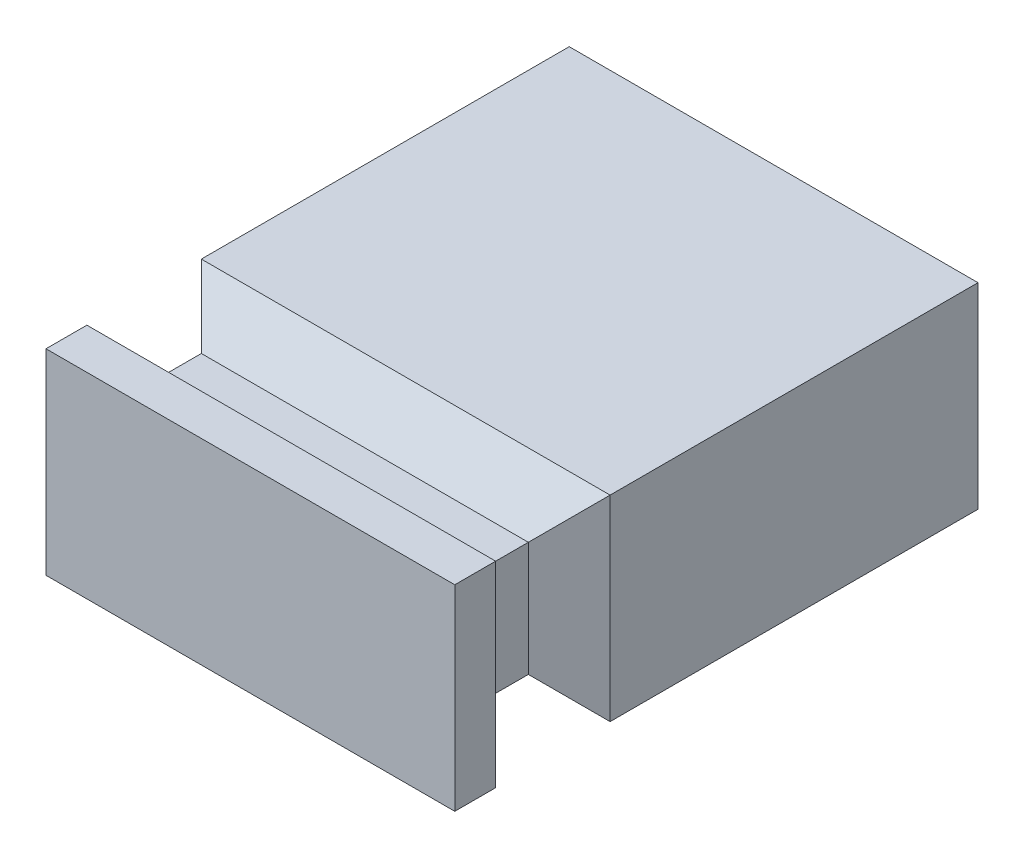
ISO-10303-21;
HEADER;
FILE_DESCRIPTION(('STEP AP214'),'2;1');
FILE_NAME('part.step','',(''),(''),'','','');
FILE_SCHEMA(('AUTOMOTIVE_DESIGN { 1 0 10303 214 1 1 1 1 }'));
ENDSEC;
DATA;
#1=APPLICATION_CONTEXT('core data for automotive mechanical design processes');
#2=APPLICATION_PROTOCOL_DEFINITION('international standard','automotive_design',2000,#1);
#3=PRODUCT_CONTEXT('',#1,'mechanical');
#4=PRODUCT('Part','Part','',(#3));
#5=PRODUCT_RELATED_PRODUCT_CATEGORY('part','',(#4));
#6=PRODUCT_DEFINITION_FORMATION('','',#4);
#7=PRODUCT_DEFINITION_CONTEXT('part definition',#1,'design');
#8=PRODUCT_DEFINITION('design','',#6,#7);
#9=PRODUCT_DEFINITION_SHAPE('','',#8);
#10=(LENGTH_UNIT() NAMED_UNIT(*) SI_UNIT(.MILLI.,.METRE.));
#11=(NAMED_UNIT(*) PLANE_ANGLE_UNIT() SI_UNIT($,.RADIAN.));
#12=(NAMED_UNIT(*) SI_UNIT($,.STERADIAN.) SOLID_ANGLE_UNIT());
#13=UNCERTAINTY_MEASURE_WITH_UNIT(LENGTH_MEASURE(1.E-05),#10,'distance_accuracy_value','');
#14=(GEOMETRIC_REPRESENTATION_CONTEXT(3) GLOBAL_UNCERTAINTY_ASSIGNED_CONTEXT((#13)) GLOBAL_UNIT_ASSIGNED_CONTEXT((#10,
#11,#12)) REPRESENTATION_CONTEXT('',''));
#15=CARTESIAN_POINT('',(0.,0.,0.));
#16=DIRECTION('',(0.,0.,1.));
#17=DIRECTION('',(1.,0.,0.));
#18=AXIS2_PLACEMENT_3D('',#15,#16,#17);
#19=CARTESIAN_POINT('',(-2.5,-1.2,5.9));
#20=DIRECTION('',(-0.707106781186548,0.,-0.707106781186548));
#21=DIRECTION('',(-0.707106781186548,0.,0.707106781186548));
#22=AXIS2_PLACEMENT_3D('',#19,#20,#21);
#23=PLANE('',#22);
#24=DIRECTION('',(-0.577350269189626,-0.577350269189626,0.577350269189626));
#25=VECTOR('',#24,1.);
#26=CARTESIAN_POINT('',(-2.,-0.7,5.4));
#27=LINE('',#26,#25);
#28=CARTESIAN_POINT('',(-2.,-0.7,5.4));
#29=VERTEX_POINT('',#28);
#30=CARTESIAN_POINT('',(-2.5,-1.2,5.9));
#31=VERTEX_POINT('',#30);
#32=EDGE_CURVE('E184',#29,#31,#27,.T.);
#33=ORIENTED_EDGE('',*,*,#32,.T.);
#34=DIRECTION('',(0.,1.,0.));
#35=VECTOR('',#34,1.);
#36=CARTESIAN_POINT('',(-2.5,-1.2,5.9));
#37=LINE('',#36,#35);
#38=CARTESIAN_POINT('',(-2.5,1.2,5.9));
#39=VERTEX_POINT('',#38);
#40=EDGE_CURVE('E155',#31,#39,#37,.T.);
#41=ORIENTED_EDGE('',*,*,#40,.T.);
#42=DIRECTION('',(0.577350269189626,-0.577350269189626,-0.577350269189626));
#43=VECTOR('',#42,1.);
#44=CARTESIAN_POINT('',(-2.5,1.2,5.9));
#45=LINE('',#44,#43);
#46=CARTESIAN_POINT('',(-2.,0.700000000000001,5.4));
#47=VERTEX_POINT('',#46);
#48=EDGE_CURVE('E19',#39,#47,#45,.T.);
#49=ORIENTED_EDGE('',*,*,#48,.T.);
#50=DIRECTION('',(0.,1.,0.));
#51=VECTOR('',#50,1.);
#52=CARTESIAN_POINT('',(-2.,-1.2,5.4));
#53=LINE('',#52,#51);
#54=EDGE_CURVE('E150',#47,#29,#53,.F.);
#55=ORIENTED_EDGE('',*,*,#54,.T.);
#56=EDGE_LOOP('',(#33,#41,#49,#55));
#57=FACE_BOUND('',#56,.T.);
#58=ADVANCED_FACE('F16',(#57),#23,.T.);
#59=CARTESIAN_POINT('',(2.5,1.2,5.9));
#60=DIRECTION('',(0.707106781186548,0.,-0.707106781186548));
#61=DIRECTION('',(-0.707106781186548,0.,-0.707106781186548));
#62=AXIS2_PLACEMENT_3D('',#59,#60,#61);
#63=PLANE('',#62);
#64=DIRECTION('',(-0.577350269189626,0.577350269189626,-0.577350269189626));
#65=VECTOR('',#64,1.);
#66=CARTESIAN_POINT('',(2.5,-1.2,5.9));
#67=LINE('',#66,#65);
#68=CARTESIAN_POINT('',(2.5,-1.2,5.9));
#69=VERTEX_POINT('',#68);
#70=CARTESIAN_POINT('',(2.,-0.700000000000001,5.4));
#71=VERTEX_POINT('',#70);
#72=EDGE_CURVE('E188',#69,#71,#67,.T.);
#73=ORIENTED_EDGE('',*,*,#72,.T.);
#74=DIRECTION('',(0.,1.,0.));
#75=VECTOR('',#74,1.);
#76=CARTESIAN_POINT('',(2.,1.2,5.4));
#77=LINE('',#76,#75);
#78=CARTESIAN_POINT('',(2.,0.7,5.4));
#79=VERTEX_POINT('',#78);
#80=EDGE_CURVE('E190',#71,#79,#77,.T.);
#81=ORIENTED_EDGE('',*,*,#80,.T.);
#82=DIRECTION('',(0.577350269189626,0.577350269189626,0.577350269189626));
#83=VECTOR('',#82,1.);
#84=CARTESIAN_POINT('',(2.,0.7,5.4));
#85=LINE('',#84,#83);
#86=CARTESIAN_POINT('',(2.5,1.2,5.9));
#87=VERTEX_POINT('',#86);
#88=EDGE_CURVE('E177',#79,#87,#85,.T.);
#89=ORIENTED_EDGE('',*,*,#88,.T.);
#90=DIRECTION('',(0.,1.,0.));
#91=VECTOR('',#90,1.);
#92=CARTESIAN_POINT('',(2.5,1.2,5.9));
#93=LINE('',#92,#91);
#94=EDGE_CURVE('E196',#87,#69,#93,.F.);
#95=ORIENTED_EDGE('',*,*,#94,.T.);
#96=EDGE_LOOP('',(#73,#81,#89,#95));
#97=FACE_BOUND('',#96,.T.);
#98=ADVANCED_FACE('F462',(#97),#63,.T.);
#99=CARTESIAN_POINT('',(-2.5,-1.2,6.4));
#100=DIRECTION('',(1.,0.,0.));
#101=DIRECTION('',(0.,0.,-1.));
#102=AXIS2_PLACEMENT_3D('',#99,#100,#101);
#103=PLANE('',#102);
#104=ORIENTED_EDGE('',*,*,#40,.F.);
#105=DIRECTION('',(0.,0.,-1.));
#106=VECTOR('',#105,1.);
#107=CARTESIAN_POINT('',(-2.5,-1.2,6.4));
#108=LINE('',#107,#106);
#109=CARTESIAN_POINT('',(-2.5,-1.2,6.4));
#110=VERTEX_POINT('',#109);
#111=EDGE_CURVE('E192',#110,#31,#108,.T.);
#112=ORIENTED_EDGE('',*,*,#111,.F.);
#113=DIRECTION('',(0.,1.,0.));
#114=VECTOR('',#113,1.);
#115=CARTESIAN_POINT('',(-2.5,-1.2,6.4));
#116=LINE('',#115,#114);
#117=CARTESIAN_POINT('',(-2.5,1.2,6.4));
#118=VERTEX_POINT('',#117);
#119=EDGE_CURVE('E205',#110,#118,#116,.T.);
#120=ORIENTED_EDGE('',*,*,#119,.T.);
#121=DIRECTION('',(0.,0.,-1.));
#122=VECTOR('',#121,1.);
#123=CARTESIAN_POINT('',(-2.5,1.2,6.4));
#124=LINE('',#123,#122);
#125=EDGE_CURVE('E201',#118,#39,#124,.T.);
#126=ORIENTED_EDGE('',*,*,#125,.T.);
#127=EDGE_LOOP('',(#104,#112,#120,#126));
#128=FACE_BOUND('',#127,.T.);
#129=ADVANCED_FACE('F459',(#128),#103,.F.);
#130=CARTESIAN_POINT('',(2.5,1.2,6.4));
#131=DIRECTION('',(-1.,0.,0.));
#132=DIRECTION('',(0.,0.,1.));
#133=AXIS2_PLACEMENT_3D('',#130,#131,#132);
#134=PLANE('',#133);
#135=ORIENTED_EDGE('',*,*,#94,.F.);
#136=DIRECTION('',(0.,0.,-1.));
#137=VECTOR('',#136,1.);
#138=CARTESIAN_POINT('',(2.5,1.2,6.4));
#139=LINE('',#138,#137);
#140=CARTESIAN_POINT('',(2.5,1.2,6.4));
#141=VERTEX_POINT('',#140);
#142=EDGE_CURVE('E203',#87,#141,#139,.F.);
#143=ORIENTED_EDGE('',*,*,#142,.T.);
#144=DIRECTION('',(0.,1.,0.));
#145=VECTOR('',#144,1.);
#146=CARTESIAN_POINT('',(2.5,-1.2,6.4));
#147=LINE('',#146,#145);
#148=CARTESIAN_POINT('',(2.5,-1.2,6.4));
#149=VERTEX_POINT('',#148);
#150=EDGE_CURVE('E211',#141,#149,#147,.F.);
#151=ORIENTED_EDGE('',*,*,#150,.T.);
#152=DIRECTION('',(0.,0.,1.));
#153=VECTOR('',#152,1.);
#154=CARTESIAN_POINT('',(2.5,-1.2,6.4));
#155=LINE('',#154,#153);
#156=EDGE_CURVE('E199',#69,#149,#155,.T.);
#157=ORIENTED_EDGE('',*,*,#156,.F.);
#158=EDGE_LOOP('',(#135,#143,#151,#157));
#159=FACE_BOUND('',#158,.T.);
#160=ADVANCED_FACE('F455',(#159),#134,.F.);
#161=CARTESIAN_POINT('',(-2.5,1.2,6.4));
#162=DIRECTION('',(0.,-1.,0.));
#163=DIRECTION('',(0.,0.,-1.));
#164=AXIS2_PLACEMENT_3D('',#161,#162,#163);
#165=PLANE('',#164);
#166=DIRECTION('',(1.,0.,0.));
#167=VECTOR('',#166,1.);
#168=CARTESIAN_POINT('',(-2.5,1.2,5.9));
#169=LINE('',#168,#167);
#170=EDGE_CURVE('E214',#39,#87,#169,.T.);
#171=ORIENTED_EDGE('',*,*,#170,.F.);
#172=ORIENTED_EDGE('',*,*,#125,.F.);
#173=DIRECTION('',(-1.,0.,0.));
#174=VECTOR('',#173,1.);
#175=CARTESIAN_POINT('',(-2.5,1.2,6.4));
#176=LINE('',#175,#174);
#177=EDGE_CURVE('E208',#118,#141,#176,.F.);
#178=ORIENTED_EDGE('',*,*,#177,.T.);
#179=ORIENTED_EDGE('',*,*,#142,.F.);
#180=EDGE_LOOP('',(#171,#172,#178,#179));
#181=FACE_BOUND('',#180,.T.);
#182=ADVANCED_FACE('F451',(#181),#165,.F.);
#183=CARTESIAN_POINT('',(-2.5,-1.2,6.4));
#184=DIRECTION('',(0.,0.,-1.));
#185=DIRECTION('',(-1.,0.,0.));
#186=AXIS2_PLACEMENT_3D('',#183,#184,#185);
#187=PLANE('',#186);
#188=ORIENTED_EDGE('',*,*,#150,.F.);
#189=ORIENTED_EDGE('',*,*,#177,.F.);
#190=ORIENTED_EDGE('',*,*,#119,.F.);
#191=DIRECTION('',(1.,0.,0.));
#192=VECTOR('',#191,1.);
#193=CARTESIAN_POINT('',(2.5,-1.2,6.4));
#194=LINE('',#193,#192);
#195=EDGE_CURVE('E179',#110,#149,#194,.T.);
#196=ORIENTED_EDGE('',*,*,#195,.T.);
#197=EDGE_LOOP('',(#188,#189,#190,#196));
#198=FACE_BOUND('',#197,.T.);
#199=ADVANCED_FACE('F448',(#198),#187,.F.);
#200=CARTESIAN_POINT('',(-2.5,1.2,5.9));
#201=DIRECTION('',(0.,0.707106781186548,-0.707106781186548));
#202=DIRECTION('',(0.,0.707106781186548,0.707106781186548));
#203=AXIS2_PLACEMENT_3D('',#200,#201,#202);
#204=PLANE('',#203);
#205=ORIENTED_EDGE('',*,*,#48,.F.);
#206=ORIENTED_EDGE('',*,*,#170,.T.);
#207=ORIENTED_EDGE('',*,*,#88,.F.);
#208=DIRECTION('',(1.,0.,0.));
#209=VECTOR('',#208,1.);
#210=CARTESIAN_POINT('',(2.,0.7,5.4));
#211=LINE('',#210,#209);
#212=EDGE_CURVE('E166',#79,#47,#211,.F.);
#213=ORIENTED_EDGE('',*,*,#212,.T.);
#214=EDGE_LOOP('',(#205,#206,#207,#213));
#215=FACE_BOUND('',#214,.T.);
#216=ADVANCED_FACE('F176',(#215),#204,.T.);
#217=CARTESIAN_POINT('',(-1.5875,0.3175,5.898025612107));
#218=DIRECTION('',(0.,-1.,0.));
#219=DIRECTION('',(1.,0.,0.));
#220=AXIS2_PLACEMENT_3D('',#217,#218,#219);
#221=PLANE('',#220);
#222=DIRECTION('',(0.,0.,1.));
#223=VECTOR('',#222,1.);
#224=CARTESIAN_POINT('',(-0.9525,0.3175,5.898025612107));
#225=LINE('',#224,#223);
#226=CARTESIAN_POINT('',(-0.9525,0.3175,5.));
#227=VERTEX_POINT('',#226);
#228=CARTESIAN_POINT('',(-0.9525,0.3175,0.));
#229=VERTEX_POINT('',#228);
#230=EDGE_CURVE('E178',#227,#229,#225,.F.);
#231=ORIENTED_EDGE('',*,*,#230,.F.);
#232=DIRECTION('',(1.,0.,0.));
#233=VECTOR('',#232,1.);
#234=CARTESIAN_POINT('',(-1.5875,0.3175,5.));
#235=LINE('',#234,#233);
#236=CARTESIAN_POINT('',(-1.5875,0.3175,5.));
#237=VERTEX_POINT('',#236);
#238=EDGE_CURVE('E218',#227,#237,#235,.F.);
#239=ORIENTED_EDGE('',*,*,#238,.T.);
#240=DIRECTION('',(0.,0.,-1.));
#241=VECTOR('',#240,1.);
#242=CARTESIAN_POINT('',(-1.5875,0.3175,5.898025612107));
#243=LINE('',#242,#241);
#244=CARTESIAN_POINT('',(-1.5875,0.3175,0.));
#245=VERTEX_POINT('',#244);
#246=EDGE_CURVE('E232',#245,#237,#243,.F.);
#247=ORIENTED_EDGE('',*,*,#246,.F.);
#248=DIRECTION('',(1.,0.,0.));
#249=VECTOR('',#248,1.);
#250=CARTESIAN_POINT('',(-1.5875,0.3175,0.));
#251=LINE('',#250,#249);
#252=EDGE_CURVE('E216',#245,#229,#251,.T.);
#253=ORIENTED_EDGE('',*,*,#252,.T.);
#254=EDGE_LOOP('',(#231,#239,#247,#253));
#255=FACE_BOUND('',#254,.T.);
#256=ADVANCED_FACE('F441',(#255),#221,.T.);
#257=CARTESIAN_POINT('',(0.9525,0.3175,5.898025612107));
#258=DIRECTION('',(0.,-1.,0.));
#259=DIRECTION('',(1.,0.,0.));
#260=AXIS2_PLACEMENT_3D('',#257,#258,#259);
#261=PLANE('',#260);
#262=DIRECTION('',(0.,0.,1.));
#263=VECTOR('',#262,1.);
#264=CARTESIAN_POINT('',(1.5875,0.3175,5.898025612107));
#265=LINE('',#264,#263);
#266=CARTESIAN_POINT('',(1.5875,0.3175,5.));
#267=VERTEX_POINT('',#266);
#268=CARTESIAN_POINT('',(1.5875,0.3175,0.));
#269=VERTEX_POINT('',#268);
#270=EDGE_CURVE('E241',#267,#269,#265,.F.);
#271=ORIENTED_EDGE('',*,*,#270,.F.);
#272=DIRECTION('',(1.,0.,0.));
#273=VECTOR('',#272,1.);
#274=CARTESIAN_POINT('',(0.9525,0.3175,5.));
#275=LINE('',#274,#273);
#276=CARTESIAN_POINT('',(0.9525,0.3175,5.));
#277=VERTEX_POINT('',#276);
#278=EDGE_CURVE('E222',#267,#277,#275,.F.);
#279=ORIENTED_EDGE('',*,*,#278,.T.);
#280=DIRECTION('',(0.,0.,-1.));
#281=VECTOR('',#280,1.);
#282=CARTESIAN_POINT('',(0.9525,0.3175,5.898025612107));
#283=LINE('',#282,#281);
#284=CARTESIAN_POINT('',(0.9525,0.3175,0.));
#285=VERTEX_POINT('',#284);
#286=EDGE_CURVE('E248',#285,#277,#283,.F.);
#287=ORIENTED_EDGE('',*,*,#286,.F.);
#288=DIRECTION('',(1.,0.,0.));
#289=VECTOR('',#288,1.);
#290=CARTESIAN_POINT('',(0.9525,0.3175,0.));
#291=LINE('',#290,#289);
#292=EDGE_CURVE('E220',#285,#269,#291,.T.);
#293=ORIENTED_EDGE('',*,*,#292,.T.);
#294=EDGE_LOOP('',(#271,#279,#287,#293));
#295=FACE_BOUND('',#294,.T.);
#296=ADVANCED_FACE('F437',(#295),#261,.T.);
#297=CARTESIAN_POINT('',(2.5,-1.2,6.4));
#298=DIRECTION('',(0.,1.,0.));
#299=DIRECTION('',(0.,0.,1.));
#300=AXIS2_PLACEMENT_3D('',#297,#298,#299);
#301=PLANE('',#300);
#302=DIRECTION('',(1.,0.,0.));
#303=VECTOR('',#302,1.);
#304=CARTESIAN_POINT('',(2.5,-1.2,5.9));
#305=LINE('',#304,#303);
#306=EDGE_CURVE('E257',#69,#31,#305,.F.);
#307=ORIENTED_EDGE('',*,*,#306,.F.);
#308=ORIENTED_EDGE('',*,*,#156,.T.);
#309=ORIENTED_EDGE('',*,*,#195,.F.);
#310=ORIENTED_EDGE('',*,*,#111,.T.);
#311=EDGE_LOOP('',(#307,#308,#309,#310));
#312=FACE_BOUND('',#311,.T.);
#313=ADVANCED_FACE('F434',(#312),#301,.F.);
#314=CARTESIAN_POINT('',(2.,0.7,5.4));
#315=DIRECTION('',(0.,-1.,0.));
#316=DIRECTION('',(0.,0.,-1.));
#317=AXIS2_PLACEMENT_3D('',#314,#315,#316);
#318=PLANE('',#317);
#319=DIRECTION('',(0.,0.,-1.));
#320=VECTOR('',#319,1.);
#321=CARTESIAN_POINT('',(-2.,0.7,5.4));
#322=LINE('',#321,#320);
#323=CARTESIAN_POINT('',(-2.,0.7,5.));
#324=VERTEX_POINT('',#323);
#325=EDGE_CURVE('E163',#324,#47,#322,.F.);
#326=ORIENTED_EDGE('',*,*,#325,.T.);
#327=ORIENTED_EDGE('',*,*,#212,.F.);
#328=DIRECTION('',(0.,0.,1.));
#329=VECTOR('',#328,1.);
#330=CARTESIAN_POINT('',(2.,0.7,5.4));
#331=LINE('',#330,#329);
#332=CARTESIAN_POINT('',(2.,0.7,5.));
#333=VERTEX_POINT('',#332);
#334=EDGE_CURVE('E260',#79,#333,#331,.F.);
#335=ORIENTED_EDGE('',*,*,#334,.T.);
#336=DIRECTION('',(1.,0.,0.));
#337=VECTOR('',#336,1.);
#338=CARTESIAN_POINT('',(-2.5,0.7,5.));
#339=LINE('',#338,#337);
#340=EDGE_CURVE('E168',#333,#324,#339,.F.);
#341=ORIENTED_EDGE('',*,*,#340,.T.);
#342=EDGE_LOOP('',(#326,#327,#335,#341));
#343=FACE_BOUND('',#342,.T.);
#344=ADVANCED_FACE('F164',(#343),#318,.F.);
#345=CARTESIAN_POINT('',(-0.9525,-0.3175,5.898025612107));
#346=DIRECTION('',(-1.,0.,0.));
#347=DIRECTION('',(0.,0.,1.));
#348=AXIS2_PLACEMENT_3D('',#345,#346,#347);
#349=PLANE('',#348);
#350=DIRECTION('',(0.,0.,1.));
#351=VECTOR('',#350,1.);
#352=CARTESIAN_POINT('',(-0.9525,-0.3175,5.898025612107));
#353=LINE('',#352,#351);
#354=CARTESIAN_POINT('',(-0.9525,-0.3175,5.));
#355=VERTEX_POINT('',#354);
#356=CARTESIAN_POINT('',(-0.9525,-0.3175,0.));
#357=VERTEX_POINT('',#356);
#358=EDGE_CURVE('E263',#355,#357,#353,.F.);
#359=ORIENTED_EDGE('',*,*,#358,.F.);
#360=DIRECTION('',(0.,1.,0.));
#361=VECTOR('',#360,1.);
#362=CARTESIAN_POINT('',(-0.9525,-0.7,5.));
#363=LINE('',#362,#361);
#364=EDGE_CURVE('E238',#355,#227,#363,.T.);
#365=ORIENTED_EDGE('',*,*,#364,.T.);
#366=ORIENTED_EDGE('',*,*,#230,.T.);
#367=DIRECTION('',(0.,1.,0.));
#368=VECTOR('',#367,1.);
#369=CARTESIAN_POINT('',(-0.9525,-0.3175,0.));
#370=LINE('',#369,#368);
#371=EDGE_CURVE('E228',#229,#357,#370,.F.);
#372=ORIENTED_EDGE('',*,*,#371,.T.);
#373=EDGE_LOOP('',(#359,#365,#366,#372));
#374=FACE_BOUND('',#373,.T.);
#375=ADVANCED_FACE('F427',(#374),#349,.T.);
#376=CARTESIAN_POINT('',(-1.5875,-0.3175,5.898025612107));
#377=DIRECTION('',(1.,0.,0.));
#378=DIRECTION('',(0.,0.,-1.));
#379=AXIS2_PLACEMENT_3D('',#376,#377,#378);
#380=PLANE('',#379);
#381=ORIENTED_EDGE('',*,*,#246,.T.);
#382=DIRECTION('',(0.,1.,0.));
#383=VECTOR('',#382,1.);
#384=CARTESIAN_POINT('',(-1.5875,-0.7,5.));
#385=LINE('',#384,#383);
#386=CARTESIAN_POINT('',(-1.5875,-0.3175,5.));
#387=VERTEX_POINT('',#386);
#388=EDGE_CURVE('E235',#237,#387,#385,.F.);
#389=ORIENTED_EDGE('',*,*,#388,.T.);
#390=DIRECTION('',(0.,0.,1.));
#391=VECTOR('',#390,1.);
#392=CARTESIAN_POINT('',(-1.5875,-0.3175,5.898025612107));
#393=LINE('',#392,#391);
#394=CARTESIAN_POINT('',(-1.5875,-0.3175,0.));
#395=VERTEX_POINT('',#394);
#396=EDGE_CURVE('E266',#395,#387,#393,.T.);
#397=ORIENTED_EDGE('',*,*,#396,.F.);
#398=DIRECTION('',(0.,1.,0.));
#399=VECTOR('',#398,1.);
#400=CARTESIAN_POINT('',(-1.5875,-0.3175,0.));
#401=LINE('',#400,#399);
#402=EDGE_CURVE('E230',#395,#245,#401,.T.);
#403=ORIENTED_EDGE('',*,*,#402,.T.);
#404=EDGE_LOOP('',(#381,#389,#397,#403));
#405=FACE_BOUND('',#404,.T.);
#406=ADVANCED_FACE('F423',(#405),#380,.T.);
#407=CARTESIAN_POINT('',(-2.,-0.7,5.));
#408=DIRECTION('',(0.,0.,1.));
#409=DIRECTION('',(1.,0.,0.));
#410=AXIS2_PLACEMENT_3D('',#407,#408,#409);
#411=PLANE('',#410);
#412=ORIENTED_EDGE('',*,*,#364,.F.);
#413=DIRECTION('',(-1.,0.,0.));
#414=VECTOR('',#413,1.);
#415=CARTESIAN_POINT('',(-1.5875,-0.3175,5.));
#416=LINE('',#415,#414);
#417=EDGE_CURVE('E268',#387,#355,#416,.F.);
#418=ORIENTED_EDGE('',*,*,#417,.F.);
#419=ORIENTED_EDGE('',*,*,#388,.F.);
#420=ORIENTED_EDGE('',*,*,#238,.F.);
#421=EDGE_LOOP('',(#412,#418,#419,#420));
#422=FACE_BOUND('',#421,.T.);
#423=ADVANCED_FACE('F419',(#422),#411,.F.);
#424=CARTESIAN_POINT('',(1.5875,-0.3175,5.898025612107));
#425=DIRECTION('',(-1.,0.,0.));
#426=DIRECTION('',(0.,0.,1.));
#427=AXIS2_PLACEMENT_3D('',#424,#425,#426);
#428=PLANE('',#427);
#429=DIRECTION('',(0.,0.,1.));
#430=VECTOR('',#429,1.);
#431=CARTESIAN_POINT('',(1.5875,-0.3175,5.898025612107));
#432=LINE('',#431,#430);
#433=CARTESIAN_POINT('',(1.5875,-0.3175,5.));
#434=VERTEX_POINT('',#433);
#435=CARTESIAN_POINT('',(1.5875,-0.3175,0.));
#436=VERTEX_POINT('',#435);
#437=EDGE_CURVE('E271',#434,#436,#432,.F.);
#438=ORIENTED_EDGE('',*,*,#437,.F.);
#439=DIRECTION('',(0.,1.,0.));
#440=VECTOR('',#439,1.);
#441=CARTESIAN_POINT('',(1.5875,-0.7,5.));
#442=LINE('',#441,#440);
#443=EDGE_CURVE('E174',#434,#267,#442,.T.);
#444=ORIENTED_EDGE('',*,*,#443,.T.);
#445=ORIENTED_EDGE('',*,*,#270,.T.);
#446=DIRECTION('',(0.,1.,0.));
#447=VECTOR('',#446,1.);
#448=CARTESIAN_POINT('',(1.5875,-0.3175,0.));
#449=LINE('',#448,#447);
#450=EDGE_CURVE('E244',#269,#436,#449,.F.);
#451=ORIENTED_EDGE('',*,*,#450,.T.);
#452=EDGE_LOOP('',(#438,#444,#445,#451));
#453=FACE_BOUND('',#452,.T.);
#454=ADVANCED_FACE('F415',(#453),#428,.T.);
#455=CARTESIAN_POINT('',(0.9525,-0.3175,5.898025612107));
#456=DIRECTION('',(1.,0.,0.));
#457=DIRECTION('',(0.,0.,-1.));
#458=AXIS2_PLACEMENT_3D('',#455,#456,#457);
#459=PLANE('',#458);
#460=ORIENTED_EDGE('',*,*,#286,.T.);
#461=DIRECTION('',(0.,1.,0.));
#462=VECTOR('',#461,1.);
#463=CARTESIAN_POINT('',(0.9525,-0.7,5.));
#464=LINE('',#463,#462);
#465=CARTESIAN_POINT('',(0.9525,-0.3175,5.));
#466=VERTEX_POINT('',#465);
#467=EDGE_CURVE('E251',#277,#466,#464,.F.);
#468=ORIENTED_EDGE('',*,*,#467,.T.);
#469=DIRECTION('',(0.,0.,1.));
#470=VECTOR('',#469,1.);
#471=CARTESIAN_POINT('',(0.9525,-0.3175,5.898025612107));
#472=LINE('',#471,#470);
#473=CARTESIAN_POINT('',(0.9525,-0.3175,0.));
#474=VERTEX_POINT('',#473);
#475=EDGE_CURVE('E274',#474,#466,#472,.T.);
#476=ORIENTED_EDGE('',*,*,#475,.F.);
#477=DIRECTION('',(0.,1.,0.));
#478=VECTOR('',#477,1.);
#479=CARTESIAN_POINT('',(0.9525,-0.3175,0.));
#480=LINE('',#479,#478);
#481=EDGE_CURVE('E246',#474,#285,#480,.T.);
#482=ORIENTED_EDGE('',*,*,#481,.T.);
#483=EDGE_LOOP('',(#460,#468,#476,#482));
#484=FACE_BOUND('',#483,.T.);
#485=ADVANCED_FACE('F411',(#484),#459,.T.);
#486=CARTESIAN_POINT('',(-2.,-0.7,5.));
#487=DIRECTION('',(0.,0.,1.));
#488=DIRECTION('',(1.,0.,0.));
#489=AXIS2_PLACEMENT_3D('',#486,#487,#488);
#490=PLANE('',#489);
#491=ORIENTED_EDGE('',*,*,#443,.F.);
#492=DIRECTION('',(-1.,0.,0.));
#493=VECTOR('',#492,1.);
#494=CARTESIAN_POINT('',(0.9525,-0.3175,5.));
#495=LINE('',#494,#493);
#496=EDGE_CURVE('E276',#466,#434,#495,.F.);
#497=ORIENTED_EDGE('',*,*,#496,.F.);
#498=ORIENTED_EDGE('',*,*,#467,.F.);
#499=ORIENTED_EDGE('',*,*,#278,.F.);
#500=EDGE_LOOP('',(#491,#497,#498,#499));
#501=FACE_BOUND('',#500,.T.);
#502=ADVANCED_FACE('F408',(#501),#490,.F.);
#503=CARTESIAN_POINT('',(-2.,0.7,5.4));
#504=DIRECTION('',(1.,0.,0.));
#505=DIRECTION('',(0.,0.,-1.));
#506=AXIS2_PLACEMENT_3D('',#503,#504,#505);
#507=PLANE('',#506);
#508=DIRECTION('',(0.,0.,-1.));
#509=VECTOR('',#508,1.);
#510=CARTESIAN_POINT('',(-2.,-0.7,5.4));
#511=LINE('',#510,#509);
#512=CARTESIAN_POINT('',(-2.,-0.7,5.));
#513=VERTEX_POINT('',#512);
#514=EDGE_CURVE('E173',#29,#513,#511,.T.);
#515=ORIENTED_EDGE('',*,*,#514,.F.);
#516=ORIENTED_EDGE('',*,*,#54,.F.);
#517=ORIENTED_EDGE('',*,*,#325,.F.);
#518=DIRECTION('',(0.,1.,0.));
#519=VECTOR('',#518,1.);
#520=CARTESIAN_POINT('',(-2.,1.2,5.));
#521=LINE('',#520,#519);
#522=EDGE_CURVE('E279',#324,#513,#521,.F.);
#523=ORIENTED_EDGE('',*,*,#522,.T.);
#524=EDGE_LOOP('',(#515,#516,#517,#523));
#525=FACE_BOUND('',#524,.T.);
#526=ADVANCED_FACE('F182',(#525),#507,.F.);
#527=CARTESIAN_POINT('',(2.5,-1.2,5.9));
#528=DIRECTION('',(0.,-0.707106781186548,-0.707106781186548));
#529=DIRECTION('',(0.,0.707106781186548,-0.707106781186548));
#530=AXIS2_PLACEMENT_3D('',#527,#528,#529);
#531=PLANE('',#530);
#532=ORIENTED_EDGE('',*,*,#72,.F.);
#533=ORIENTED_EDGE('',*,*,#306,.T.);
#534=ORIENTED_EDGE('',*,*,#32,.F.);
#535=DIRECTION('',(1.,0.,0.));
#536=VECTOR('',#535,1.);
#537=CARTESIAN_POINT('',(-2.,-0.7,5.4));
#538=LINE('',#537,#536);
#539=EDGE_CURVE('E285',#29,#71,#538,.T.);
#540=ORIENTED_EDGE('',*,*,#539,.T.);
#541=EDGE_LOOP('',(#532,#533,#534,#540));
#542=FACE_BOUND('',#541,.T.);
#543=ADVANCED_FACE('F401',(#542),#531,.T.);
#544=CARTESIAN_POINT('',(2.,-0.7,5.4));
#545=DIRECTION('',(-1.,0.,0.));
#546=DIRECTION('',(0.,0.,1.));
#547=AXIS2_PLACEMENT_3D('',#544,#545,#546);
#548=PLANE('',#547);
#549=ORIENTED_EDGE('',*,*,#334,.F.);
#550=ORIENTED_EDGE('',*,*,#80,.F.);
#551=DIRECTION('',(0.,0.,1.));
#552=VECTOR('',#551,1.);
#553=CARTESIAN_POINT('',(2.,-0.7,5.4));
#554=LINE('',#553,#552);
#555=CARTESIAN_POINT('',(2.,-0.7,5.));
#556=VERTEX_POINT('',#555);
#557=EDGE_CURVE('E288',#71,#556,#554,.F.);
#558=ORIENTED_EDGE('',*,*,#557,.T.);
#559=DIRECTION('',(0.,1.,0.));
#560=VECTOR('',#559,1.);
#561=CARTESIAN_POINT('',(2.,1.2,5.));
#562=LINE('',#561,#560);
#563=EDGE_CURVE('E291',#556,#333,#562,.T.);
#564=ORIENTED_EDGE('',*,*,#563,.T.);
#565=EDGE_LOOP('',(#549,#550,#558,#564));
#566=FACE_BOUND('',#565,.T.);
#567=ADVANCED_FACE('F397',(#566),#548,.F.);
#568=CARTESIAN_POINT('',(-2.5,0.7,5.));
#569=DIRECTION('',(0.,-0.707106781186548,-0.707106781186548));
#570=DIRECTION('',(0.,0.707106781186548,-0.707106781186548));
#571=AXIS2_PLACEMENT_3D('',#568,#569,#570);
#572=PLANE('',#571);
#573=DIRECTION('',(1.,0.,0.));
#574=VECTOR('',#573,1.);
#575=CARTESIAN_POINT('',(-2.5,1.2,4.5));
#576=LINE('',#575,#574);
#577=CARTESIAN_POINT('',(2.5,1.2,4.5));
#578=VERTEX_POINT('',#577);
#579=CARTESIAN_POINT('',(-2.5,1.2,4.5));
#580=VERTEX_POINT('',#579);
#581=EDGE_CURVE('E297',#578,#580,#576,.F.);
#582=ORIENTED_EDGE('',*,*,#581,.T.);
#583=DIRECTION('',(0.577350269189626,-0.577350269189626,0.577350269189626));
#584=VECTOR('',#583,1.);
#585=CARTESIAN_POINT('',(-2.5,1.2,4.5));
#586=LINE('',#585,#584);
#587=EDGE_CURVE('E283',#580,#324,#586,.T.);
#588=ORIENTED_EDGE('',*,*,#587,.T.);
#589=ORIENTED_EDGE('',*,*,#340,.F.);
#590=DIRECTION('',(0.577350269189626,0.577350269189626,-0.577350269189626));
#591=VECTOR('',#590,1.);
#592=CARTESIAN_POINT('',(2.,0.7,5.));
#593=LINE('',#592,#591);
#594=EDGE_CURVE('E294',#333,#578,#593,.T.);
#595=ORIENTED_EDGE('',*,*,#594,.T.);
#596=EDGE_LOOP('',(#582,#588,#589,#595));
#597=FACE_BOUND('',#596,.T.);
#598=ADVANCED_FACE('F393',(#597),#572,.F.);
#599=CARTESIAN_POINT('',(-1.5875,-0.3175,5.898025612107));
#600=DIRECTION('',(0.,1.,0.));
#601=DIRECTION('',(-1.,0.,0.));
#602=AXIS2_PLACEMENT_3D('',#599,#600,#601);
#603=PLANE('',#602);
#604=ORIENTED_EDGE('',*,*,#396,.T.);
#605=ORIENTED_EDGE('',*,*,#417,.T.);
#606=ORIENTED_EDGE('',*,*,#358,.T.);
#607=DIRECTION('',(-1.,0.,0.));
#608=VECTOR('',#607,1.);
#609=CARTESIAN_POINT('',(-2.5,-0.3175,0.));
#610=LINE('',#609,#608);
#611=EDGE_CURVE('E300',#395,#357,#610,.F.);
#612=ORIENTED_EDGE('',*,*,#611,.F.);
#613=EDGE_LOOP('',(#604,#605,#606,#612));
#614=FACE_BOUND('',#613,.T.);
#615=ADVANCED_FACE('F389',(#614),#603,.T.);
#616=CARTESIAN_POINT('',(0.9525,-0.3175,5.898025612107));
#617=DIRECTION('',(0.,1.,0.));
#618=DIRECTION('',(-1.,0.,0.));
#619=AXIS2_PLACEMENT_3D('',#616,#617,#618);
#620=PLANE('',#619);
#621=ORIENTED_EDGE('',*,*,#475,.T.);
#622=ORIENTED_EDGE('',*,*,#496,.T.);
#623=ORIENTED_EDGE('',*,*,#437,.T.);
#624=DIRECTION('',(-1.,0.,0.));
#625=VECTOR('',#624,1.);
#626=CARTESIAN_POINT('',(-2.5,-0.3175,0.));
#627=LINE('',#626,#625);
#628=EDGE_CURVE('E305',#474,#436,#627,.F.);
#629=ORIENTED_EDGE('',*,*,#628,.F.);
#630=EDGE_LOOP('',(#621,#622,#623,#629));
#631=FACE_BOUND('',#630,.T.);
#632=ADVANCED_FACE('F385',(#631),#620,.T.);
#633=CARTESIAN_POINT('',(-2.,1.2,5.));
#634=DIRECTION('',(0.707106781186548,0.,-0.707106781186548));
#635=DIRECTION('',(-0.707106781186548,0.,-0.707106781186548));
#636=AXIS2_PLACEMENT_3D('',#633,#634,#635);
#637=PLANE('',#636);
#638=DIRECTION('',(0.,1.,0.));
#639=VECTOR('',#638,1.);
#640=CARTESIAN_POINT('',(-2.5,-1.2,4.5));
#641=LINE('',#640,#639);
#642=CARTESIAN_POINT('',(-2.5,-1.2,4.5));
#643=VERTEX_POINT('',#642);
#644=EDGE_CURVE('E314',#580,#643,#641,.F.);
#645=ORIENTED_EDGE('',*,*,#644,.T.);
#646=DIRECTION('',(-0.577350269189626,-0.577350269189626,-0.577350269189626));
#647=VECTOR('',#646,1.);
#648=CARTESIAN_POINT('',(-2.,-0.700000000000001,5.));
#649=LINE('',#648,#647);
#650=EDGE_CURVE('E281',#513,#643,#649,.T.);
#651=ORIENTED_EDGE('',*,*,#650,.F.);
#652=ORIENTED_EDGE('',*,*,#522,.F.);
#653=ORIENTED_EDGE('',*,*,#587,.F.);
#654=EDGE_LOOP('',(#645,#651,#652,#653));
#655=FACE_BOUND('',#654,.T.);
#656=ADVANCED_FACE('F381',(#655),#637,.F.);
#657=CARTESIAN_POINT('',(-2.,-0.7,5.4));
#658=DIRECTION('',(0.,1.,0.));
#659=DIRECTION('',(0.,0.,1.));
#660=AXIS2_PLACEMENT_3D('',#657,#658,#659);
#661=PLANE('',#660);
#662=ORIENTED_EDGE('',*,*,#557,.F.);
#663=ORIENTED_EDGE('',*,*,#539,.F.);
#664=ORIENTED_EDGE('',*,*,#514,.T.);
#665=DIRECTION('',(1.,0.,0.));
#666=VECTOR('',#665,1.);
#667=CARTESIAN_POINT('',(-2.5,-0.7,5.));
#668=LINE('',#667,#666);
#669=EDGE_CURVE('E317',#513,#556,#668,.T.);
#670=ORIENTED_EDGE('',*,*,#669,.T.);
#671=EDGE_LOOP('',(#662,#663,#664,#670));
#672=FACE_BOUND('',#671,.T.);
#673=ADVANCED_FACE('F377',(#672),#661,.F.);
#674=CARTESIAN_POINT('',(2.,1.2,5.));
#675=DIRECTION('',(-0.707106781186548,0.,-0.707106781186548));
#676=DIRECTION('',(-0.707106781186548,0.,0.707106781186548));
#677=AXIS2_PLACEMENT_3D('',#674,#675,#676);
#678=PLANE('',#677);
#679=DIRECTION('',(0.,1.,0.));
#680=VECTOR('',#679,1.);
#681=CARTESIAN_POINT('',(2.5,-1.2,4.5));
#682=LINE('',#681,#680);
#683=CARTESIAN_POINT('',(2.5,-1.2,4.5));
#684=VERTEX_POINT('',#683);
#685=EDGE_CURVE('E33',#684,#578,#682,.T.);
#686=ORIENTED_EDGE('',*,*,#685,.T.);
#687=ORIENTED_EDGE('',*,*,#594,.F.);
#688=ORIENTED_EDGE('',*,*,#563,.F.);
#689=DIRECTION('',(0.577350269189626,-0.577350269189626,-0.577350269189626));
#690=VECTOR('',#689,1.);
#691=CARTESIAN_POINT('',(2.,-0.7,5.));
#692=LINE('',#691,#690);
#693=EDGE_CURVE('E320',#556,#684,#692,.T.);
#694=ORIENTED_EDGE('',*,*,#693,.T.);
#695=EDGE_LOOP('',(#686,#687,#688,#694));
#696=FACE_BOUND('',#695,.T.);
#697=ADVANCED_FACE('F373',(#696),#678,.F.);
#698=CARTESIAN_POINT('',(-2.5,1.2,5.));
#699=DIRECTION('',(0.,-1.,0.));
#700=DIRECTION('',(0.,0.,-1.));
#701=AXIS2_PLACEMENT_3D('',#698,#699,#700);
#702=PLANE('',#701);
#703=ORIENTED_EDGE('',*,*,#581,.F.);
#704=DIRECTION('',(0.,0.,1.));
#705=VECTOR('',#704,1.);
#706=CARTESIAN_POINT('',(2.5,1.2,5.));
#707=LINE('',#706,#705);
#708=CARTESIAN_POINT('',(2.5,1.2,0.));
#709=VERTEX_POINT('',#708);
#710=EDGE_CURVE('E326',#578,#709,#707,.F.);
#711=ORIENTED_EDGE('',*,*,#710,.T.);
#712=DIRECTION('',(-1.,0.,0.));
#713=VECTOR('',#712,1.);
#714=CARTESIAN_POINT('',(-2.5,1.2,0.));
#715=LINE('',#714,#713);
#716=CARTESIAN_POINT('',(-2.5,1.2,0.));
#717=VERTEX_POINT('',#716);
#718=EDGE_CURVE('E303',#717,#709,#715,.F.);
#719=ORIENTED_EDGE('',*,*,#718,.F.);
#720=DIRECTION('',(0.,0.,-1.));
#721=VECTOR('',#720,1.);
#722=CARTESIAN_POINT('',(-2.5,1.2,5.));
#723=LINE('',#722,#721);
#724=EDGE_CURVE('E311',#717,#580,#723,.F.);
#725=ORIENTED_EDGE('',*,*,#724,.T.);
#726=EDGE_LOOP('',(#703,#711,#719,#725));
#727=FACE_BOUND('',#726,.T.);
#728=ADVANCED_FACE('F369',(#727),#702,.F.);
#729=CARTESIAN_POINT('',(-2.5,1.2,0.));
#730=DIRECTION('',(0.,0.,-1.));
#731=DIRECTION('',(-1.,0.,0.));
#732=AXIS2_PLACEMENT_3D('',#729,#730,#731);
#733=PLANE('',#732);
#734=ORIENTED_EDGE('',*,*,#481,.F.);
#735=ORIENTED_EDGE('',*,*,#628,.T.);
#736=ORIENTED_EDGE('',*,*,#450,.F.);
#737=ORIENTED_EDGE('',*,*,#292,.F.);
#738=EDGE_LOOP('',(#734,#735,#736,#737));
#739=FACE_BOUND('',#738,.T.);
#740=DIRECTION('',(0.,1.,0.));
#741=VECTOR('',#740,1.);
#742=CARTESIAN_POINT('',(2.5,-1.2,0.));
#743=LINE('',#742,#741);
#744=CARTESIAN_POINT('',(2.5,-1.2,0.));
#745=VERTEX_POINT('',#744);
#746=EDGE_CURVE('E322',#709,#745,#743,.F.);
#747=ORIENTED_EDGE('',*,*,#746,.T.);
#748=DIRECTION('',(1.,0.,0.));
#749=VECTOR('',#748,1.);
#750=CARTESIAN_POINT('',(-2.5,-1.2,0.));
#751=LINE('',#750,#749);
#752=CARTESIAN_POINT('',(-2.5,-1.2,0.));
#753=VERTEX_POINT('',#752);
#754=EDGE_CURVE('E329',#745,#753,#751,.F.);
#755=ORIENTED_EDGE('',*,*,#754,.T.);
#756=DIRECTION('',(0.,1.,0.));
#757=VECTOR('',#756,1.);
#758=CARTESIAN_POINT('',(-2.5,-1.2,0.));
#759=LINE('',#758,#757);
#760=EDGE_CURVE('E308',#753,#717,#759,.T.);
#761=ORIENTED_EDGE('',*,*,#760,.T.);
#762=ORIENTED_EDGE('',*,*,#718,.T.);
#763=EDGE_LOOP('',(#747,#755,#761,#762));
#764=FACE_BOUND('',#763,.T.);
#765=ORIENTED_EDGE('',*,*,#402,.F.);
#766=ORIENTED_EDGE('',*,*,#611,.T.);
#767=ORIENTED_EDGE('',*,*,#371,.F.);
#768=ORIENTED_EDGE('',*,*,#252,.F.);
#769=EDGE_LOOP('',(#765,#766,#767,#768));
#770=FACE_BOUND('',#769,.T.);
#771=ADVANCED_FACE('F351',(#739,#764,#770),#733,.T.);
#772=CARTESIAN_POINT('',(-2.5,-1.2,5.));
#773=DIRECTION('',(1.,0.,0.));
#774=DIRECTION('',(0.,0.,-1.));
#775=AXIS2_PLACEMENT_3D('',#772,#773,#774);
#776=PLANE('',#775);
#777=ORIENTED_EDGE('',*,*,#644,.F.);
#778=ORIENTED_EDGE('',*,*,#724,.F.);
#779=ORIENTED_EDGE('',*,*,#760,.F.);
#780=DIRECTION('',(0.,0.,1.));
#781=VECTOR('',#780,1.);
#782=CARTESIAN_POINT('',(-2.5,-1.2,5.));
#783=LINE('',#782,#781);
#784=EDGE_CURVE('E332',#753,#643,#783,.T.);
#785=ORIENTED_EDGE('',*,*,#784,.T.);
#786=EDGE_LOOP('',(#777,#778,#779,#785));
#787=FACE_BOUND('',#786,.T.);
#788=ADVANCED_FACE('F348',(#787),#776,.F.);
#789=CARTESIAN_POINT('',(-2.5,-0.7,5.));
#790=DIRECTION('',(0.,0.707106781186548,-0.707106781186548));
#791=DIRECTION('',(0.,0.707106781186548,0.707106781186548));
#792=AXIS2_PLACEMENT_3D('',#789,#790,#791);
#793=PLANE('',#792);
#794=ORIENTED_EDGE('',*,*,#669,.F.);
#795=ORIENTED_EDGE('',*,*,#650,.T.);
#796=DIRECTION('',(1.,0.,0.));
#797=VECTOR('',#796,1.);
#798=CARTESIAN_POINT('',(-2.5,-1.2,4.5));
#799=LINE('',#798,#797);
#800=EDGE_CURVE('E25',#643,#684,#799,.T.);
#801=ORIENTED_EDGE('',*,*,#800,.T.);
#802=ORIENTED_EDGE('',*,*,#693,.F.);
#803=EDGE_LOOP('',(#794,#795,#801,#802));
#804=FACE_BOUND('',#803,.T.);
#805=ADVANCED_FACE('F340',(#804),#793,.F.);
#806=CARTESIAN_POINT('',(2.5,-1.2,5.));
#807=DIRECTION('',(-1.,0.,0.));
#808=DIRECTION('',(0.,0.,1.));
#809=AXIS2_PLACEMENT_3D('',#806,#807,#808);
#810=PLANE('',#809);
#811=ORIENTED_EDGE('',*,*,#685,.F.);
#812=DIRECTION('',(0.,0.,1.));
#813=VECTOR('',#812,1.);
#814=CARTESIAN_POINT('',(2.5,-1.2,5.));
#815=LINE('',#814,#813);
#816=EDGE_CURVE('E11',#684,#745,#815,.F.);
#817=ORIENTED_EDGE('',*,*,#816,.T.);
#818=ORIENTED_EDGE('',*,*,#746,.F.);
#819=ORIENTED_EDGE('',*,*,#710,.F.);
#820=EDGE_LOOP('',(#811,#817,#818,#819));
#821=FACE_BOUND('',#820,.T.);
#822=ADVANCED_FACE('F354',(#821),#810,.F.);
#823=CARTESIAN_POINT('',(-2.5,-1.2,5.));
#824=DIRECTION('',(0.,1.,0.));
#825=DIRECTION('',(0.,0.,1.));
#826=AXIS2_PLACEMENT_3D('',#823,#824,#825);
#827=PLANE('',#826);
#828=ORIENTED_EDGE('',*,*,#800,.F.);
#829=ORIENTED_EDGE('',*,*,#784,.F.);
#830=ORIENTED_EDGE('',*,*,#754,.F.);
#831=ORIENTED_EDGE('',*,*,#816,.F.);
#832=EDGE_LOOP('',(#828,#829,#830,#831));
#833=FACE_BOUND('',#832,.T.);
#834=ADVANCED_FACE('F345',(#833),#827,.F.);
#835=CLOSED_SHELL('',(#58,#98,#129,#160,#182,#199,#216,#256,#296,#313,#344,#375,#406,#423,#454,
#485,#502,#526,#543,#567,#598,#615,#632,#656,#673,#697,#728,#771,#788,#805,#822,#834));
#836=MANIFOLD_SOLID_BREP('B1',#835);
#837=ADVANCED_BREP_SHAPE_REPRESENTATION('',(#18,#836),#14);
#838=SHAPE_DEFINITION_REPRESENTATION(#9,#837);
ENDSEC;
END-ISO-10303-21;
